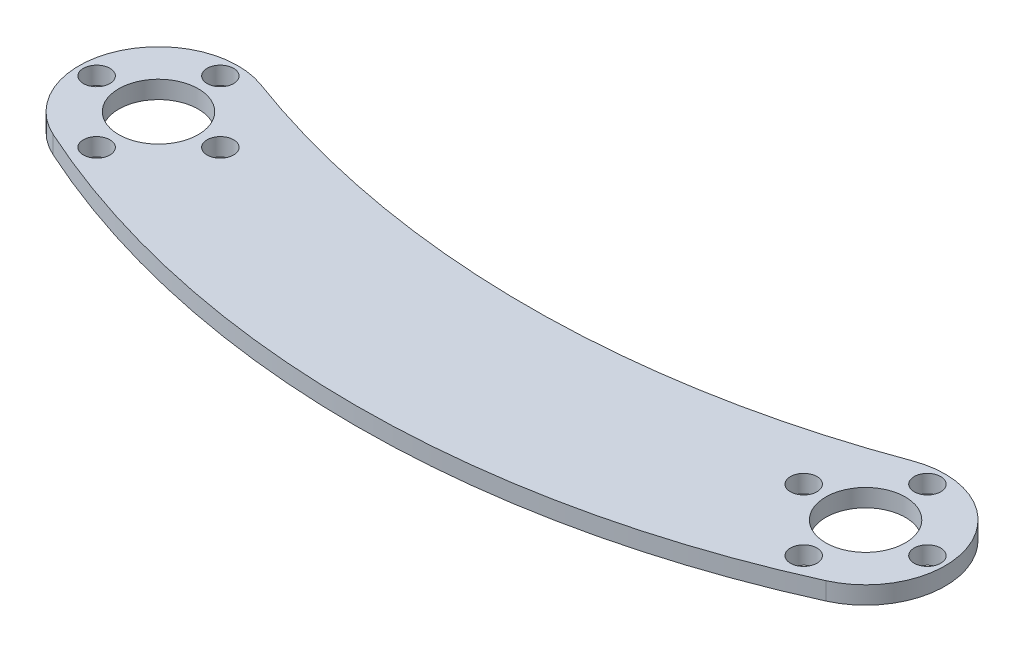
ISO-10303-21;
HEADER;
FILE_DESCRIPTION(('STEP AP214'),'2;1');
FILE_NAME('part.step','',(''),(''),'','','');
FILE_SCHEMA(('AUTOMOTIVE_DESIGN { 1 0 10303 214 1 1 1 1 }'));
ENDSEC;
DATA;
#1=APPLICATION_CONTEXT('core data for automotive mechanical design processes');
#2=APPLICATION_PROTOCOL_DEFINITION('international standard','automotive_design',2000,#1);
#3=PRODUCT_CONTEXT('',#1,'mechanical');
#4=PRODUCT('Part','Part','',(#3));
#5=PRODUCT_RELATED_PRODUCT_CATEGORY('part','',(#4));
#6=PRODUCT_DEFINITION_FORMATION('','',#4);
#7=PRODUCT_DEFINITION_CONTEXT('part definition',#1,'design');
#8=PRODUCT_DEFINITION('design','',#6,#7);
#9=PRODUCT_DEFINITION_SHAPE('','',#8);
#10=(LENGTH_UNIT() NAMED_UNIT(*) SI_UNIT(.MILLI.,.METRE.));
#11=(NAMED_UNIT(*) PLANE_ANGLE_UNIT() SI_UNIT($,.RADIAN.));
#12=(NAMED_UNIT(*) SI_UNIT($,.STERADIAN.) SOLID_ANGLE_UNIT());
#13=UNCERTAINTY_MEASURE_WITH_UNIT(LENGTH_MEASURE(1.E-05),#10,'distance_accuracy_value','');
#14=(GEOMETRIC_REPRESENTATION_CONTEXT(3) GLOBAL_UNCERTAINTY_ASSIGNED_CONTEXT((#13)) GLOBAL_UNIT_ASSIGNED_CONTEXT((#10,
#11,#12)) REPRESENTATION_CONTEXT('',''));
#15=CARTESIAN_POINT('',(0.,0.,0.));
#16=DIRECTION('',(0.,0.,1.));
#17=DIRECTION('',(1.,0.,0.));
#18=AXIS2_PLACEMENT_3D('',#15,#16,#17);
#19=CARTESIAN_POINT('',(0.,2.,0.));
#20=DIRECTION('',(0.,-1.,0.));
#21=DIRECTION('',(0.,0.,-1.));
#22=AXIS2_PLACEMENT_3D('',#19,#20,#21);
#23=CYLINDRICAL_SURFACE('',#22,8.99999999999999);
#24=CARTESIAN_POINT('',(0.,0.,0.));
#25=DIRECTION('',(0.,1.,0.));
#26=DIRECTION('',(0.,0.,-1.));
#27=AXIS2_PLACEMENT_3D('',#24,#25,#26);
#28=CIRCLE('',#27,8.99999999999999);
#29=CARTESIAN_POINT('',(3.13043478260863,0.,-8.43803164676656));
#30=VERTEX_POINT('',#29);
#31=CARTESIAN_POINT('',(-3.71134020618559,0.,8.19914348416651));
#32=VERTEX_POINT('',#31);
#33=EDGE_CURVE('E107',#30,#32,#28,.T.);
#34=ORIENTED_EDGE('',*,*,#33,.T.);
#35=DIRECTION('',(0.,-1.,0.));
#36=VECTOR('',#35,1.);
#37=CARTESIAN_POINT('',(-3.71134020618559,2.,8.19914348416651));
#38=LINE('',#37,#36);
#39=CARTESIAN_POINT('',(-3.71134020618559,2.,8.19914348416651));
#40=VERTEX_POINT('',#39);
#41=EDGE_CURVE('E11',#40,#32,#38,.T.);
#42=ORIENTED_EDGE('',*,*,#41,.F.);
#43=CARTESIAN_POINT('',(0.,2.,0.));
#44=DIRECTION('',(0.,1.,0.));
#45=DIRECTION('',(0.,0.,-1.));
#46=AXIS2_PLACEMENT_3D('',#43,#44,#45);
#47=CIRCLE('',#46,8.99999999999999);
#48=CARTESIAN_POINT('',(3.13043478260863,2.,-8.43803164676656));
#49=VERTEX_POINT('',#48);
#50=EDGE_CURVE('E91',#49,#40,#47,.T.);
#51=ORIENTED_EDGE('',*,*,#50,.F.);
#52=DIRECTION('',(0.,-1.,0.));
#53=VECTOR('',#52,1.);
#54=CARTESIAN_POINT('',(3.13043478260863,2.,-8.43803164676656));
#55=LINE('',#54,#53);
#56=EDGE_CURVE('E103',#49,#30,#55,.T.);
#57=ORIENTED_EDGE('',*,*,#56,.T.);
#58=EDGE_LOOP('',(#34,#42,#51,#57));
#59=FACE_BOUND('',#58,.T.);
#60=ADVANCED_FACE('F39',(#59),#23,.T.);
#61=CARTESIAN_POINT('',(40.,2.,-88.3685464404615));
#62=DIRECTION('',(0.,-1.,0.));
#63=DIRECTION('',(0.,0.,-1.));
#64=AXIS2_PLACEMENT_3D('',#61,#62,#63);
#65=CYLINDRICAL_SURFACE('',#64,106.);
#66=CARTESIAN_POINT('',(40.,0.,-88.3685464404615));
#67=DIRECTION('',(0.,1.,0.));
#68=DIRECTION('',(0.,0.,1.));
#69=AXIS2_PLACEMENT_3D('',#66,#67,#68);
#70=CIRCLE('',#69,106.);
#71=CARTESIAN_POINT('',(83.7113402061856,0.,8.19914348416652));
#72=VERTEX_POINT('',#71);
#73=EDGE_CURVE('E96',#32,#72,#70,.T.);
#74=ORIENTED_EDGE('',*,*,#73,.T.);
#75=DIRECTION('',(0.,-1.,0.));
#76=VECTOR('',#75,1.);
#77=CARTESIAN_POINT('',(83.7113402061856,2.,8.19914348416652));
#78=LINE('',#77,#76);
#79=CARTESIAN_POINT('',(83.7113402061856,2.,8.19914348416652));
#80=VERTEX_POINT('',#79);
#81=EDGE_CURVE('E48',#80,#72,#78,.T.);
#82=ORIENTED_EDGE('',*,*,#81,.F.);
#83=CARTESIAN_POINT('',(40.,2.,-88.3685464404615));
#84=DIRECTION('',(0.,1.,0.));
#85=DIRECTION('',(0.,0.,1.));
#86=AXIS2_PLACEMENT_3D('',#83,#84,#85);
#87=CIRCLE('',#86,106.);
#88=EDGE_CURVE('E86',#40,#80,#87,.T.);
#89=ORIENTED_EDGE('',*,*,#88,.F.);
#90=ORIENTED_EDGE('',*,*,#41,.T.);
#91=EDGE_LOOP('',(#74,#82,#89,#90));
#92=FACE_BOUND('',#91,.T.);
#93=ADVANCED_FACE('F95',(#92),#65,.T.);
#94=CARTESIAN_POINT('',(80.,2.,0.));
#95=DIRECTION('',(0.,-1.,0.));
#96=DIRECTION('',(0.,0.,-1.));
#97=AXIS2_PLACEMENT_3D('',#94,#95,#96);
#98=CYLINDRICAL_SURFACE('',#97,8.99999999999999);
#99=CARTESIAN_POINT('',(80.,0.,0.));
#100=DIRECTION('',(0.,1.,0.));
#101=DIRECTION('',(0.,0.,1.));
#102=AXIS2_PLACEMENT_3D('',#99,#100,#101);
#103=CIRCLE('',#102,8.99999999999999);
#104=CARTESIAN_POINT('',(76.8695652173913,0.,-8.43803164676656));
#105=VERTEX_POINT('',#104);
#106=EDGE_CURVE('E73',#72,#105,#103,.T.);
#107=ORIENTED_EDGE('',*,*,#106,.T.);
#108=DIRECTION('',(0.,-1.,0.));
#109=VECTOR('',#108,1.);
#110=CARTESIAN_POINT('',(76.8695652173913,2.,-8.43803164676656));
#111=LINE('',#110,#109);
#112=CARTESIAN_POINT('',(76.8695652173913,2.,-8.43803164676656));
#113=VERTEX_POINT('',#112);
#114=EDGE_CURVE('E98',#113,#105,#111,.T.);
#115=ORIENTED_EDGE('',*,*,#114,.F.);
#116=CARTESIAN_POINT('',(80.,2.,0.));
#117=DIRECTION('',(0.,1.,0.));
#118=DIRECTION('',(0.,0.,1.));
#119=AXIS2_PLACEMENT_3D('',#116,#117,#118);
#120=CIRCLE('',#119,8.99999999999999);
#121=EDGE_CURVE('E89',#80,#113,#120,.T.);
#122=ORIENTED_EDGE('',*,*,#121,.F.);
#123=ORIENTED_EDGE('',*,*,#81,.T.);
#124=EDGE_LOOP('',(#107,#115,#122,#123));
#125=FACE_BOUND('',#124,.T.);
#126=ADVANCED_FACE('F99',(#125),#98,.T.);
#127=CARTESIAN_POINT('',(40.,2.,-107.819293264239));
#128=DIRECTION('',(0.,-1.,0.));
#129=DIRECTION('',(0.,0.,-1.));
#130=AXIS2_PLACEMENT_3D('',#127,#128,#129);
#131=CYLINDRICAL_SURFACE('',#130,106.);
#132=CARTESIAN_POINT('',(40.,0.,-107.819293264239));
#133=DIRECTION('',(0.,-1.,0.));
#134=DIRECTION('',(0.,0.,1.));
#135=AXIS2_PLACEMENT_3D('',#132,#133,#134);
#136=CIRCLE('',#135,106.);
#137=EDGE_CURVE('E79',#105,#30,#136,.T.);
#138=ORIENTED_EDGE('',*,*,#137,.T.);
#139=ORIENTED_EDGE('',*,*,#56,.F.);
#140=CARTESIAN_POINT('',(40.,2.,-107.819293264239));
#141=DIRECTION('',(0.,-1.,0.));
#142=DIRECTION('',(0.,0.,1.));
#143=AXIS2_PLACEMENT_3D('',#140,#141,#142);
#144=CIRCLE('',#143,106.);
#145=EDGE_CURVE('E56',#113,#49,#144,.T.);
#146=ORIENTED_EDGE('',*,*,#145,.F.);
#147=ORIENTED_EDGE('',*,*,#114,.T.);
#148=EDGE_LOOP('',(#138,#139,#146,#147));
#149=FACE_BOUND('',#148,.T.);
#150=ADVANCED_FACE('F121',(#149),#131,.F.);
#151=CARTESIAN_POINT('',(20.,2.,-53.9096466321196));
#152=DIRECTION('',(0.,-1.,0.));
#153=DIRECTION('',(0.,0.,-1.));
#154=AXIS2_PLACEMENT_3D('',#151,#152,#153);
#155=PLANE('',#154);
#156=CARTESIAN_POINT('',(87.,2.,0.));
#157=DIRECTION('',(0.,1.,0.));
#158=DIRECTION('',(0.,0.,1.));
#159=AXIS2_PLACEMENT_3D('',#156,#157,#158);
#160=CIRCLE('',#159,1.49999999999999);
#161=CARTESIAN_POINT('',(87.,2.,1.50000000000003));
#162=VERTEX_POINT('',#161);
#163=EDGE_CURVE('E168',#162,#162,#160,.T.);
#164=ORIENTED_EDGE('',*,*,#163,.F.);
#165=EDGE_LOOP('',(#164));
#166=FACE_BOUND('',#165,.T.);
#167=CARTESIAN_POINT('',(80.,2.,-7.00000000000002));
#168=DIRECTION('',(0.,1.,0.));
#169=DIRECTION('',(0.,0.,1.));
#170=AXIS2_PLACEMENT_3D('',#167,#168,#169);
#171=CIRCLE('',#170,1.49999999999999);
#172=CARTESIAN_POINT('',(80.,2.,-5.50000000000003));
#173=VERTEX_POINT('',#172);
#174=EDGE_CURVE('E177',#173,#173,#171,.T.);
#175=ORIENTED_EDGE('',*,*,#174,.F.);
#176=EDGE_LOOP('',(#175));
#177=FACE_BOUND('',#176,.T.);
#178=CARTESIAN_POINT('',(0.,2.,-7.));
#179=DIRECTION('',(0.,1.,0.));
#180=DIRECTION('',(0.,0.,1.));
#181=AXIS2_PLACEMENT_3D('',#178,#179,#180);
#182=CIRCLE('',#181,1.5);
#183=CARTESIAN_POINT('',(0.,2.,-5.5));
#184=VERTEX_POINT('',#183);
#185=EDGE_CURVE('E185',#184,#184,#182,.T.);
#186=ORIENTED_EDGE('',*,*,#185,.F.);
#187=EDGE_LOOP('',(#186));
#188=FACE_BOUND('',#187,.T.);
#189=CARTESIAN_POINT('',(-7.,2.,0.));
#190=DIRECTION('',(0.,1.,0.));
#191=DIRECTION('',(0.,0.,1.));
#192=AXIS2_PLACEMENT_3D('',#189,#190,#191);
#193=CIRCLE('',#192,1.5);
#194=CARTESIAN_POINT('',(-7.,2.,1.49999999999995));
#195=VERTEX_POINT('',#194);
#196=EDGE_CURVE('E193',#195,#195,#193,.T.);
#197=ORIENTED_EDGE('',*,*,#196,.F.);
#198=EDGE_LOOP('',(#197));
#199=FACE_BOUND('',#198,.T.);
#200=CARTESIAN_POINT('',(80.,2.,0.));
#201=DIRECTION('',(0.,1.,0.));
#202=DIRECTION('',(0.,0.,1.));
#203=AXIS2_PLACEMENT_3D('',#200,#201,#202);
#204=CIRCLE('',#203,4.5);
#205=CARTESIAN_POINT('',(80.,2.,4.5));
#206=VERTEX_POINT('',#205);
#207=EDGE_CURVE('E145',#206,#206,#204,.T.);
#208=ORIENTED_EDGE('',*,*,#207,.F.);
#209=EDGE_LOOP('',(#208));
#210=FACE_BOUND('',#209,.T.);
#211=CARTESIAN_POINT('',(7.,2.,0.));
#212=DIRECTION('',(0.,1.,0.));
#213=DIRECTION('',(0.,0.,1.));
#214=AXIS2_PLACEMENT_3D('',#211,#212,#213);
#215=CIRCLE('',#214,1.5);
#216=CARTESIAN_POINT('',(7.,2.,1.5));
#217=VERTEX_POINT('',#216);
#218=EDGE_CURVE('E136',#217,#217,#215,.T.);
#219=ORIENTED_EDGE('',*,*,#218,.F.);
#220=EDGE_LOOP('',(#219));
#221=FACE_BOUND('',#220,.T.);
#222=CARTESIAN_POINT('',(73.,2.,0.));
#223=DIRECTION('',(0.,1.,0.));
#224=DIRECTION('',(0.,0.,1.));
#225=AXIS2_PLACEMENT_3D('',#222,#223,#224);
#226=CIRCLE('',#225,1.5);
#227=CARTESIAN_POINT('',(73.,2.,1.5));
#228=VERTEX_POINT('',#227);
#229=EDGE_CURVE('E161',#228,#228,#226,.T.);
#230=ORIENTED_EDGE('',*,*,#229,.F.);
#231=EDGE_LOOP('',(#230));
#232=FACE_BOUND('',#231,.T.);
#233=CARTESIAN_POINT('',(0.,2.,7.));
#234=DIRECTION('',(0.,1.,0.));
#235=DIRECTION('',(0.,0.,1.));
#236=AXIS2_PLACEMENT_3D('',#233,#234,#235);
#237=CIRCLE('',#236,1.5);
#238=CARTESIAN_POINT('',(0.,2.,8.5));
#239=VERTEX_POINT('',#238);
#240=EDGE_CURVE('E152',#239,#239,#237,.T.);
#241=ORIENTED_EDGE('',*,*,#240,.F.);
#242=EDGE_LOOP('',(#241));
#243=FACE_BOUND('',#242,.T.);
#244=CARTESIAN_POINT('',(79.9999999999999,2.,6.99999999999999));
#245=DIRECTION('',(0.,1.,0.));
#246=DIRECTION('',(0.,0.,1.));
#247=AXIS2_PLACEMENT_3D('',#244,#245,#246);
#248=CIRCLE('',#247,1.49999999999999);
#249=CARTESIAN_POINT('',(79.9999999999999,2.,8.49999999999999));
#250=VERTEX_POINT('',#249);
#251=EDGE_CURVE('E200',#250,#250,#248,.T.);
#252=ORIENTED_EDGE('',*,*,#251,.F.);
#253=EDGE_LOOP('',(#252));
#254=FACE_BOUND('',#253,.T.);
#255=CARTESIAN_POINT('',(0.,2.,0.));
#256=DIRECTION('',(0.,1.,0.));
#257=DIRECTION('',(0.,0.,1.));
#258=AXIS2_PLACEMENT_3D('',#255,#256,#257);
#259=CIRCLE('',#258,4.5);
#260=CARTESIAN_POINT('',(0.,2.,4.5));
#261=VERTEX_POINT('',#260);
#262=EDGE_CURVE('E128',#261,#261,#259,.T.);
#263=ORIENTED_EDGE('',*,*,#262,.F.);
#264=EDGE_LOOP('',(#263));
#265=FACE_BOUND('',#264,.T.);
#266=ORIENTED_EDGE('',*,*,#50,.T.);
#267=ORIENTED_EDGE('',*,*,#88,.T.);
#268=ORIENTED_EDGE('',*,*,#121,.T.);
#269=ORIENTED_EDGE('',*,*,#145,.T.);
#270=EDGE_LOOP('',(#266,#267,#268,#269));
#271=FACE_BOUND('',#270,.T.);
#272=ADVANCED_FACE('F87',(#166,#177,#188,#199,#210,#221,#232,#243,#254,#265,#271),#155,.F.);
#273=CARTESIAN_POINT('',(20.,0.,-53.9096466321196));
#274=DIRECTION('',(0.,-1.,0.));
#275=DIRECTION('',(0.,0.,-1.));
#276=AXIS2_PLACEMENT_3D('',#273,#274,#275);
#277=PLANE('',#276);
#278=CARTESIAN_POINT('',(87.,0.,0.));
#279=DIRECTION('',(0.,1.,0.));
#280=DIRECTION('',(0.,0.,1.));
#281=AXIS2_PLACEMENT_3D('',#278,#279,#280);
#282=CIRCLE('',#281,1.49999999999999);
#283=CARTESIAN_POINT('',(87.,0.,1.50000000000003));
#284=VERTEX_POINT('',#283);
#285=EDGE_CURVE('E172',#284,#284,#282,.T.);
#286=ORIENTED_EDGE('',*,*,#285,.T.);
#287=EDGE_LOOP('',(#286));
#288=FACE_BOUND('',#287,.T.);
#289=CARTESIAN_POINT('',(80.,0.,-7.00000000000002));
#290=DIRECTION('',(0.,1.,0.));
#291=DIRECTION('',(0.,0.,1.));
#292=AXIS2_PLACEMENT_3D('',#289,#290,#291);
#293=CIRCLE('',#292,1.49999999999999);
#294=CARTESIAN_POINT('',(80.,0.,-5.50000000000003));
#295=VERTEX_POINT('',#294);
#296=EDGE_CURVE('E181',#295,#295,#293,.T.);
#297=ORIENTED_EDGE('',*,*,#296,.T.);
#298=EDGE_LOOP('',(#297));
#299=FACE_BOUND('',#298,.T.);
#300=CARTESIAN_POINT('',(0.,0.,-7.));
#301=DIRECTION('',(0.,1.,0.));
#302=DIRECTION('',(0.,0.,1.));
#303=AXIS2_PLACEMENT_3D('',#300,#301,#302);
#304=CIRCLE('',#303,1.5);
#305=CARTESIAN_POINT('',(0.,0.,-5.5));
#306=VERTEX_POINT('',#305);
#307=EDGE_CURVE('E189',#306,#306,#304,.T.);
#308=ORIENTED_EDGE('',*,*,#307,.T.);
#309=EDGE_LOOP('',(#308));
#310=FACE_BOUND('',#309,.T.);
#311=CARTESIAN_POINT('',(-7.,0.,0.));
#312=DIRECTION('',(0.,1.,0.));
#313=DIRECTION('',(0.,0.,1.));
#314=AXIS2_PLACEMENT_3D('',#311,#312,#313);
#315=CIRCLE('',#314,1.5);
#316=CARTESIAN_POINT('',(-7.,0.,1.49999999999995));
#317=VERTEX_POINT('',#316);
#318=EDGE_CURVE('E157',#317,#317,#315,.T.);
#319=ORIENTED_EDGE('',*,*,#318,.T.);
#320=EDGE_LOOP('',(#319));
#321=FACE_BOUND('',#320,.T.);
#322=CARTESIAN_POINT('',(80.,0.,0.));
#323=DIRECTION('',(0.,1.,0.));
#324=DIRECTION('',(0.,0.,1.));
#325=AXIS2_PLACEMENT_3D('',#322,#323,#324);
#326=CIRCLE('',#325,4.5);
#327=CARTESIAN_POINT('',(80.,0.,4.5));
#328=VERTEX_POINT('',#327);
#329=EDGE_CURVE('E132',#328,#328,#326,.T.);
#330=ORIENTED_EDGE('',*,*,#329,.T.);
#331=EDGE_LOOP('',(#330));
#332=FACE_BOUND('',#331,.T.);
#333=CARTESIAN_POINT('',(7.,0.,0.));
#334=DIRECTION('',(0.,1.,0.));
#335=DIRECTION('',(0.,0.,1.));
#336=AXIS2_PLACEMENT_3D('',#333,#334,#335);
#337=CIRCLE('',#336,1.5);
#338=CARTESIAN_POINT('',(7.,0.,1.5));
#339=VERTEX_POINT('',#338);
#340=EDGE_CURVE('E140',#339,#339,#337,.T.);
#341=ORIENTED_EDGE('',*,*,#340,.T.);
#342=EDGE_LOOP('',(#341));
#343=FACE_BOUND('',#342,.T.);
#344=CARTESIAN_POINT('',(73.,0.,0.));
#345=DIRECTION('',(0.,1.,0.));
#346=DIRECTION('',(0.,0.,1.));
#347=AXIS2_PLACEMENT_3D('',#344,#345,#346);
#348=CIRCLE('',#347,1.5);
#349=CARTESIAN_POINT('',(73.,0.,1.5));
#350=VERTEX_POINT('',#349);
#351=EDGE_CURVE('E141',#350,#350,#348,.T.);
#352=ORIENTED_EDGE('',*,*,#351,.T.);
#353=EDGE_LOOP('',(#352));
#354=FACE_BOUND('',#353,.T.);
#355=CARTESIAN_POINT('',(0.,0.,7.));
#356=DIRECTION('',(0.,1.,0.));
#357=DIRECTION('',(0.,0.,1.));
#358=AXIS2_PLACEMENT_3D('',#355,#356,#357);
#359=CIRCLE('',#358,1.5);
#360=CARTESIAN_POINT('',(0.,0.,8.5));
#361=VERTEX_POINT('',#360);
#362=EDGE_CURVE('E156',#361,#361,#359,.T.);
#363=ORIENTED_EDGE('',*,*,#362,.T.);
#364=EDGE_LOOP('',(#363));
#365=FACE_BOUND('',#364,.T.);
#366=CARTESIAN_POINT('',(79.9999999999999,0.,6.99999999999999));
#367=DIRECTION('',(0.,1.,0.));
#368=DIRECTION('',(0.,0.,1.));
#369=AXIS2_PLACEMENT_3D('',#366,#367,#368);
#370=CIRCLE('',#369,1.49999999999999);
#371=CARTESIAN_POINT('',(79.9999999999999,0.,8.49999999999999));
#372=VERTEX_POINT('',#371);
#373=EDGE_CURVE('E173',#372,#372,#370,.T.);
#374=ORIENTED_EDGE('',*,*,#373,.T.);
#375=EDGE_LOOP('',(#374));
#376=FACE_BOUND('',#375,.T.);
#377=CARTESIAN_POINT('',(0.,0.,0.));
#378=DIRECTION('',(0.,1.,0.));
#379=DIRECTION('',(0.,0.,1.));
#380=AXIS2_PLACEMENT_3D('',#377,#378,#379);
#381=CIRCLE('',#380,4.5);
#382=CARTESIAN_POINT('',(0.,0.,4.5));
#383=VERTEX_POINT('',#382);
#384=EDGE_CURVE('E111',#383,#383,#381,.T.);
#385=ORIENTED_EDGE('',*,*,#384,.T.);
#386=EDGE_LOOP('',(#385));
#387=FACE_BOUND('',#386,.T.);
#388=ORIENTED_EDGE('',*,*,#33,.F.);
#389=ORIENTED_EDGE('',*,*,#137,.F.);
#390=ORIENTED_EDGE('',*,*,#106,.F.);
#391=ORIENTED_EDGE('',*,*,#73,.F.);
#392=EDGE_LOOP('',(#388,#389,#390,#391));
#393=FACE_BOUND('',#392,.T.);
#394=ADVANCED_FACE('F124',(#288,#299,#310,#321,#332,#343,#354,#365,#376,#387,#393),#277,.T.);
#395=CARTESIAN_POINT('',(0.,0.,0.));
#396=DIRECTION('',(0.,1.,0.));
#397=DIRECTION('',(0.,0.,1.));
#398=AXIS2_PLACEMENT_3D('',#395,#396,#397);
#399=CYLINDRICAL_SURFACE('',#398,4.5);
#400=ORIENTED_EDGE('',*,*,#384,.F.);
#401=EDGE_LOOP('',(#400));
#402=FACE_BOUND('',#401,.T.);
#403=ORIENTED_EDGE('',*,*,#262,.T.);
#404=EDGE_LOOP('',(#403));
#405=FACE_BOUND('',#404,.T.);
#406=ADVANCED_FACE('F214',(#402,#405),#399,.F.);
#407=CARTESIAN_POINT('',(79.9999999999999,0.,6.99999999999999));
#408=DIRECTION('',(0.,1.,0.));
#409=DIRECTION('',(0.,0.,1.));
#410=AXIS2_PLACEMENT_3D('',#407,#408,#409);
#411=CYLINDRICAL_SURFACE('',#410,1.49999999999999);
#412=ORIENTED_EDGE('',*,*,#373,.F.);
#413=EDGE_LOOP('',(#412));
#414=FACE_BOUND('',#413,.T.);
#415=ORIENTED_EDGE('',*,*,#251,.T.);
#416=EDGE_LOOP('',(#415));
#417=FACE_BOUND('',#416,.T.);
#418=ADVANCED_FACE('F210',(#414,#417),#411,.F.);
#419=CARTESIAN_POINT('',(0.,0.,7.));
#420=DIRECTION('',(0.,1.,0.));
#421=DIRECTION('',(0.,0.,1.));
#422=AXIS2_PLACEMENT_3D('',#419,#420,#421);
#423=CYLINDRICAL_SURFACE('',#422,1.5);
#424=ORIENTED_EDGE('',*,*,#362,.F.);
#425=EDGE_LOOP('',(#424));
#426=FACE_BOUND('',#425,.T.);
#427=ORIENTED_EDGE('',*,*,#240,.T.);
#428=EDGE_LOOP('',(#427));
#429=FACE_BOUND('',#428,.T.);
#430=ADVANCED_FACE('F213',(#426,#429),#423,.F.);
#431=CARTESIAN_POINT('',(73.,0.,0.));
#432=DIRECTION('',(0.,1.,0.));
#433=DIRECTION('',(0.,0.,1.));
#434=AXIS2_PLACEMENT_3D('',#431,#432,#433);
#435=CYLINDRICAL_SURFACE('',#434,1.5);
#436=ORIENTED_EDGE('',*,*,#351,.F.);
#437=EDGE_LOOP('',(#436));
#438=FACE_BOUND('',#437,.T.);
#439=ORIENTED_EDGE('',*,*,#229,.T.);
#440=EDGE_LOOP('',(#439));
#441=FACE_BOUND('',#440,.T.);
#442=ADVANCED_FACE('F275',(#438,#441),#435,.F.);
#443=CARTESIAN_POINT('',(7.,0.,0.));
#444=DIRECTION('',(0.,1.,0.));
#445=DIRECTION('',(0.,0.,1.));
#446=AXIS2_PLACEMENT_3D('',#443,#444,#445);
#447=CYLINDRICAL_SURFACE('',#446,1.5);
#448=ORIENTED_EDGE('',*,*,#340,.F.);
#449=EDGE_LOOP('',(#448));
#450=FACE_BOUND('',#449,.T.);
#451=ORIENTED_EDGE('',*,*,#218,.T.);
#452=EDGE_LOOP('',(#451));
#453=FACE_BOUND('',#452,.T.);
#454=ADVANCED_FACE('F285',(#450,#453),#447,.F.);
#455=CARTESIAN_POINT('',(80.,0.,0.));
#456=DIRECTION('',(0.,1.,0.));
#457=DIRECTION('',(0.,0.,1.));
#458=AXIS2_PLACEMENT_3D('',#455,#456,#457);
#459=CYLINDRICAL_SURFACE('',#458,4.5);
#460=ORIENTED_EDGE('',*,*,#329,.F.);
#461=EDGE_LOOP('',(#460));
#462=FACE_BOUND('',#461,.T.);
#463=ORIENTED_EDGE('',*,*,#207,.T.);
#464=EDGE_LOOP('',(#463));
#465=FACE_BOUND('',#464,.T.);
#466=ADVANCED_FACE('F295',(#462,#465),#459,.F.);
#467=CARTESIAN_POINT('',(-7.,0.,0.));
#468=DIRECTION('',(0.,1.,0.));
#469=DIRECTION('',(0.,0.,1.));
#470=AXIS2_PLACEMENT_3D('',#467,#468,#469);
#471=CYLINDRICAL_SURFACE('',#470,1.5);
#472=ORIENTED_EDGE('',*,*,#318,.F.);
#473=EDGE_LOOP('',(#472));
#474=FACE_BOUND('',#473,.T.);
#475=ORIENTED_EDGE('',*,*,#196,.T.);
#476=EDGE_LOOP('',(#475));
#477=FACE_BOUND('',#476,.T.);
#478=ADVANCED_FACE('F304',(#474,#477),#471,.F.);
#479=CARTESIAN_POINT('',(0.,0.,-7.));
#480=DIRECTION('',(0.,1.,0.));
#481=DIRECTION('',(0.,0.,1.));
#482=AXIS2_PLACEMENT_3D('',#479,#480,#481);
#483=CYLINDRICAL_SURFACE('',#482,1.5);
#484=ORIENTED_EDGE('',*,*,#307,.F.);
#485=EDGE_LOOP('',(#484));
#486=FACE_BOUND('',#485,.T.);
#487=ORIENTED_EDGE('',*,*,#185,.T.);
#488=EDGE_LOOP('',(#487));
#489=FACE_BOUND('',#488,.T.);
#490=ADVANCED_FACE('F314',(#486,#489),#483,.F.);
#491=CARTESIAN_POINT('',(80.,0.,-7.00000000000002));
#492=DIRECTION('',(0.,1.,0.));
#493=DIRECTION('',(0.,0.,1.));
#494=AXIS2_PLACEMENT_3D('',#491,#492,#493);
#495=CYLINDRICAL_SURFACE('',#494,1.49999999999999);
#496=ORIENTED_EDGE('',*,*,#296,.F.);
#497=EDGE_LOOP('',(#496));
#498=FACE_BOUND('',#497,.T.);
#499=ORIENTED_EDGE('',*,*,#174,.T.);
#500=EDGE_LOOP('',(#499));
#501=FACE_BOUND('',#500,.T.);
#502=ADVANCED_FACE('F324',(#498,#501),#495,.F.);
#503=CARTESIAN_POINT('',(87.,0.,0.));
#504=DIRECTION('',(0.,1.,0.));
#505=DIRECTION('',(0.,0.,1.));
#506=AXIS2_PLACEMENT_3D('',#503,#504,#505);
#507=CYLINDRICAL_SURFACE('',#506,1.49999999999999);
#508=ORIENTED_EDGE('',*,*,#285,.F.);
#509=EDGE_LOOP('',(#508));
#510=FACE_BOUND('',#509,.T.);
#511=ORIENTED_EDGE('',*,*,#163,.T.);
#512=EDGE_LOOP('',(#511));
#513=FACE_BOUND('',#512,.T.);
#514=ADVANCED_FACE('F334',(#510,#513),#507,.F.);
#515=CLOSED_SHELL('',(#60,#93,#126,#150,#272,#394,#406,#418,#430,#442,#454,#466,#478,#490,#502,#514));
#516=MANIFOLD_SOLID_BREP('B2',#515);
#517=ADVANCED_BREP_SHAPE_REPRESENTATION('',(#18,#516),#14);
#518=SHAPE_DEFINITION_REPRESENTATION(#9,#517);
ENDSEC;
END-ISO-10303-21;
